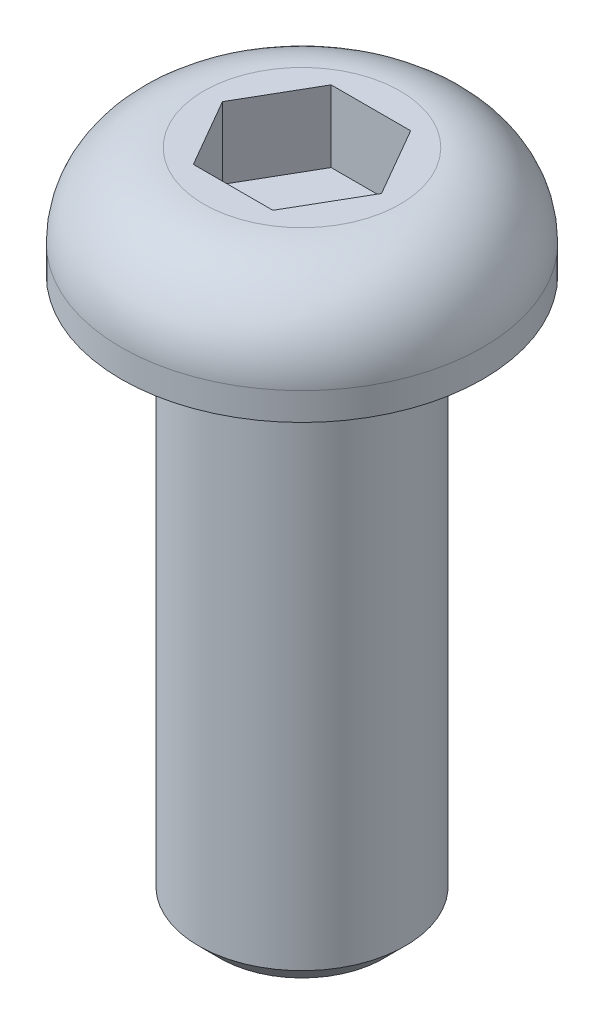
ISO-10303-21;
HEADER;
FILE_DESCRIPTION(('STEP AP214'),'2;1');
FILE_NAME('part.step','',(''),(''),'','','');
FILE_SCHEMA(('AUTOMOTIVE_DESIGN { 1 0 10303 214 1 1 1 1 }'));
ENDSEC;
DATA;
#1=APPLICATION_CONTEXT('core data for automotive mechanical design processes');
#2=APPLICATION_PROTOCOL_DEFINITION('international standard','automotive_design',2000,#1);
#3=PRODUCT_CONTEXT('',#1,'mechanical');
#4=PRODUCT('Part','Part','',(#3));
#5=PRODUCT_RELATED_PRODUCT_CATEGORY('part','',(#4));
#6=PRODUCT_DEFINITION_FORMATION('','',#4);
#7=PRODUCT_DEFINITION_CONTEXT('part definition',#1,'design');
#8=PRODUCT_DEFINITION('design','',#6,#7);
#9=PRODUCT_DEFINITION_SHAPE('','',#8);
#10=(LENGTH_UNIT() NAMED_UNIT(*) SI_UNIT(.MILLI.,.METRE.));
#11=(NAMED_UNIT(*) PLANE_ANGLE_UNIT() SI_UNIT($,.RADIAN.));
#12=(NAMED_UNIT(*) SI_UNIT($,.STERADIAN.) SOLID_ANGLE_UNIT());
#13=UNCERTAINTY_MEASURE_WITH_UNIT(LENGTH_MEASURE(1.E-05),#10,'distance_accuracy_value','');
#14=(GEOMETRIC_REPRESENTATION_CONTEXT(3) GLOBAL_UNCERTAINTY_ASSIGNED_CONTEXT((#13)) GLOBAL_UNIT_ASSIGNED_CONTEXT((#10,
#11,#12)) REPRESENTATION_CONTEXT('',''));
#15=CARTESIAN_POINT('',(0.,0.,0.));
#16=DIRECTION('',(0.,0.,1.));
#17=DIRECTION('',(1.,0.,0.));
#18=AXIS2_PLACEMENT_3D('',#15,#16,#17);
#19=CARTESIAN_POINT('',(0.,0.,0.));
#20=DIRECTION('',(0.,-1.,0.));
#21=DIRECTION('',(1.,0.,0.));
#22=AXIS2_PLACEMENT_3D('',#19,#20,#21);
#23=PLANE('',#22);
#24=DIRECTION('',(-0.5,0.,-0.866025403784438));
#25=VECTOR('',#24,1.);
#26=CARTESIAN_POINT('',(2.3094010767585,0.,0.));
#27=LINE('',#26,#25);
#28=CARTESIAN_POINT('',(2.3094010767585,0.,0.));
#29=VERTEX_POINT('',#28);
#30=CARTESIAN_POINT('',(1.15470053837925,0.,-2.));
#31=VERTEX_POINT('',#30);
#32=EDGE_CURVE('E143',#29,#31,#27,.T.);
#33=ORIENTED_EDGE('',*,*,#32,.F.);
#34=DIRECTION('',(0.5,0.,-0.866025403784439));
#35=VECTOR('',#34,1.);
#36=CARTESIAN_POINT('',(1.15470053837925,0.,2.));
#37=LINE('',#36,#35);
#38=CARTESIAN_POINT('',(1.15470053837925,0.,2.));
#39=VERTEX_POINT('',#38);
#40=EDGE_CURVE('E69',#39,#29,#37,.T.);
#41=ORIENTED_EDGE('',*,*,#40,.F.);
#42=DIRECTION('',(1.,0.,0.));
#43=VECTOR('',#42,1.);
#44=CARTESIAN_POINT('',(-1.15470053837925,0.,2.));
#45=LINE('',#44,#43);
#46=CARTESIAN_POINT('',(-1.15470053837925,0.,2.));
#47=VERTEX_POINT('',#46);
#48=EDGE_CURVE('E152',#47,#39,#45,.T.);
#49=ORIENTED_EDGE('',*,*,#48,.F.);
#50=DIRECTION('',(0.5,0.,0.866025403784439));
#51=VECTOR('',#50,1.);
#52=CARTESIAN_POINT('',(-2.3094010767585,0.,0.));
#53=LINE('',#52,#51);
#54=CARTESIAN_POINT('',(-2.3094010767585,0.,0.));
#55=VERTEX_POINT('',#54);
#56=EDGE_CURVE('E150',#55,#47,#53,.T.);
#57=ORIENTED_EDGE('',*,*,#56,.F.);
#58=DIRECTION('',(-0.5,0.,0.866025403784439));
#59=VECTOR('',#58,1.);
#60=CARTESIAN_POINT('',(-1.15470053837925,0.,-2.));
#61=LINE('',#60,#59);
#62=CARTESIAN_POINT('',(-1.15470053837925,0.,-2.));
#63=VERTEX_POINT('',#62);
#64=EDGE_CURVE('E117',#63,#55,#61,.T.);
#65=ORIENTED_EDGE('',*,*,#64,.F.);
#66=DIRECTION('',(-1.,0.,0.));
#67=VECTOR('',#66,1.);
#68=CARTESIAN_POINT('',(1.15470053837925,0.,-2.));
#69=LINE('',#68,#67);
#70=EDGE_CURVE('E146',#31,#63,#69,.T.);
#71=ORIENTED_EDGE('',*,*,#70,.F.);
#72=EDGE_LOOP('',(#33,#41,#49,#57,#65,#71));
#73=FACE_BOUND('',#72,.T.);
#74=CARTESIAN_POINT('',(0.,0.,0.));
#75=DIRECTION('',(0.,1.,0.));
#76=DIRECTION('',(-1.,0.,0.));
#77=AXIS2_PLACEMENT_3D('',#74,#75,#76);
#78=CIRCLE('',#77,2.85);
#79=CARTESIAN_POINT('',(-2.85,0.,0.));
#80=VERTEX_POINT('',#79);
#81=EDGE_CURVE('E167',#80,#80,#78,.T.);
#82=ORIENTED_EDGE('',*,*,#81,.T.);
#83=EDGE_LOOP('',(#82));
#84=FACE_BOUND('',#83,.T.);
#85=ADVANCED_FACE('F53',(#73,#84),#23,.F.);
#86=CARTESIAN_POINT('',(0.,-2.4,0.));
#87=DIRECTION('',(0.,1.,0.));
#88=DIRECTION('',(-1.,0.,0.));
#89=AXIS2_PLACEMENT_3D('',#86,#87,#88);
#90=TOROIDAL_SURFACE('',#89,2.85,2.4);
#91=ORIENTED_EDGE('',*,*,#81,.F.);
#92=EDGE_LOOP('',(#91));
#93=FACE_BOUND('',#92,.T.);
#94=CARTESIAN_POINT('',(0.,-2.4,0.));
#95=DIRECTION('',(0.,1.,0.));
#96=DIRECTION('',(-1.,0.,0.));
#97=AXIS2_PLACEMENT_3D('',#94,#95,#96);
#98=CIRCLE('',#97,5.25);
#99=CARTESIAN_POINT('',(-5.25,-2.4,0.));
#100=VERTEX_POINT('',#99);
#101=EDGE_CURVE('E164',#100,#100,#98,.T.);
#102=ORIENTED_EDGE('',*,*,#101,.T.);
#103=EDGE_LOOP('',(#102));
#104=FACE_BOUND('',#103,.T.);
#105=ADVANCED_FACE('F192',(#93,#104),#90,.T.);
#106=CARTESIAN_POINT('',(0.,5.,0.));
#107=DIRECTION('',(0.,1.,0.));
#108=DIRECTION('',(-1.,0.,0.));
#109=AXIS2_PLACEMENT_3D('',#106,#107,#108);
#110=CYLINDRICAL_SURFACE('',#109,5.25);
#111=ORIENTED_EDGE('',*,*,#101,.F.);
#112=EDGE_LOOP('',(#111));
#113=FACE_BOUND('',#112,.T.);
#114=CARTESIAN_POINT('',(0.,-3.2,0.));
#115=DIRECTION('',(0.,1.,0.));
#116=DIRECTION('',(-1.,0.,0.));
#117=AXIS2_PLACEMENT_3D('',#114,#115,#116);
#118=CIRCLE('',#117,5.25);
#119=CARTESIAN_POINT('',(-5.25,-3.2,0.));
#120=VERTEX_POINT('',#119);
#121=EDGE_CURVE('E156',#120,#120,#118,.T.);
#122=ORIENTED_EDGE('',*,*,#121,.T.);
#123=EDGE_LOOP('',(#122));
#124=FACE_BOUND('',#123,.T.);
#125=ADVANCED_FACE('F200',(#113,#124),#110,.T.);
#126=CARTESIAN_POINT('',(5.25,-3.2,0.));
#127=DIRECTION('',(0.,1.,0.));
#128=DIRECTION('',(-1.,0.,0.));
#129=AXIS2_PLACEMENT_3D('',#126,#127,#128);
#130=PLANE('',#129);
#131=CARTESIAN_POINT('',(0.,-3.2,0.));
#132=DIRECTION('',(0.,1.,0.));
#133=DIRECTION('',(-1.,0.,0.));
#134=AXIS2_PLACEMENT_3D('',#131,#132,#133);
#135=CIRCLE('',#134,3.25);
#136=CARTESIAN_POINT('',(-3.25,-3.2,0.));
#137=VERTEX_POINT('',#136);
#138=EDGE_CURVE('E170',#137,#137,#135,.T.);
#139=ORIENTED_EDGE('',*,*,#138,.T.);
#140=EDGE_LOOP('',(#139));
#141=FACE_BOUND('',#140,.T.);
#142=ORIENTED_EDGE('',*,*,#121,.F.);
#143=EDGE_LOOP('',(#142));
#144=FACE_BOUND('',#143,.T.);
#145=ADVANCED_FACE('F207',(#141,#144),#130,.F.);
#146=CARTESIAN_POINT('',(0.,5.,0.));
#147=DIRECTION('',(0.,1.,0.));
#148=DIRECTION('',(-1.,0.,0.));
#149=AXIS2_PLACEMENT_3D('',#146,#147,#148);
#150=CYLINDRICAL_SURFACE('',#149,3.);
#151=CARTESIAN_POINT('',(0.,-18.575,0.));
#152=DIRECTION('',(0.,1.,0.));
#153=DIRECTION('',(-1.,0.,0.));
#154=AXIS2_PLACEMENT_3D('',#151,#152,#153);
#155=CIRCLE('',#154,3.);
#156=CARTESIAN_POINT('',(-3.,-18.575,0.));
#157=VERTEX_POINT('',#156);
#158=EDGE_CURVE('E62',#157,#157,#155,.T.);
#159=ORIENTED_EDGE('',*,*,#158,.T.);
#160=EDGE_LOOP('',(#159));
#161=FACE_BOUND('',#160,.T.);
#162=CARTESIAN_POINT('',(0.,-3.45,0.));
#163=DIRECTION('',(0.,1.,0.));
#164=DIRECTION('',(-1.,0.,0.));
#165=AXIS2_PLACEMENT_3D('',#162,#163,#164);
#166=CIRCLE('',#165,3.);
#167=CARTESIAN_POINT('',(-3.,-3.45,0.));
#168=VERTEX_POINT('',#167);
#169=EDGE_CURVE('E173',#168,#168,#166,.F.);
#170=ORIENTED_EDGE('',*,*,#169,.T.);
#171=EDGE_LOOP('',(#170));
#172=FACE_BOUND('',#171,.T.);
#173=ADVANCED_FACE('F178',(#161,#172),#150,.T.);
#174=CARTESIAN_POINT('',(3.,-19.2,0.));
#175=DIRECTION('',(0.,1.,0.));
#176=DIRECTION('',(-1.,0.,0.));
#177=AXIS2_PLACEMENT_3D('',#174,#175,#176);
#178=PLANE('',#177);
#179=CARTESIAN_POINT('',(0.,-19.2,0.));
#180=DIRECTION('',(0.,1.,0.));
#181=DIRECTION('',(-1.,0.,0.));
#182=AXIS2_PLACEMENT_3D('',#179,#180,#181);
#183=CIRCLE('',#182,2.375);
#184=CARTESIAN_POINT('',(-2.37499999999999,-19.2,0.));
#185=VERTEX_POINT('',#184);
#186=EDGE_CURVE('E11',#185,#185,#183,.F.);
#187=ORIENTED_EDGE('',*,*,#186,.T.);
#188=EDGE_LOOP('',(#187));
#189=FACE_BOUND('',#188,.T.);
#190=ADVANCED_FACE('F214',(#189),#178,.F.);
#191=CARTESIAN_POINT('',(1.15470053837925,-2.08,2.));
#192=DIRECTION('',(0.866025403784439,0.,0.5));
#193=DIRECTION('',(0.5,0.,-0.866025403784439));
#194=AXIS2_PLACEMENT_3D('',#191,#192,#193);
#195=PLANE('',#194);
#196=ORIENTED_EDGE('',*,*,#40,.T.);
#197=DIRECTION('',(0.,1.,0.));
#198=VECTOR('',#197,1.);
#199=CARTESIAN_POINT('',(2.3094010767585,-2.08,0.));
#200=LINE('',#199,#198);
#201=CARTESIAN_POINT('',(2.3094010767585,-2.08,0.));
#202=VERTEX_POINT('',#201);
#203=EDGE_CURVE('E99',#202,#29,#200,.T.);
#204=ORIENTED_EDGE('',*,*,#203,.F.);
#205=DIRECTION('',(0.5,0.,-0.866025403784439));
#206=VECTOR('',#205,1.);
#207=CARTESIAN_POINT('',(1.15470053837925,-2.08,2.));
#208=LINE('',#207,#206);
#209=CARTESIAN_POINT('',(1.15470053837925,-2.08,2.));
#210=VERTEX_POINT('',#209);
#211=EDGE_CURVE('E154',#210,#202,#208,.T.);
#212=ORIENTED_EDGE('',*,*,#211,.F.);
#213=DIRECTION('',(0.,1.,0.));
#214=VECTOR('',#213,1.);
#215=CARTESIAN_POINT('',(1.15470053837925,-2.08,2.));
#216=LINE('',#215,#214);
#217=EDGE_CURVE('E77',#210,#39,#216,.T.);
#218=ORIENTED_EDGE('',*,*,#217,.T.);
#219=EDGE_LOOP('',(#196,#204,#212,#218));
#220=FACE_BOUND('',#219,.T.);
#221=ADVANCED_FACE('F217',(#220),#195,.F.);
#222=CARTESIAN_POINT('',(-1.15470053837925,-2.08,2.));
#223=DIRECTION('',(0.,0.,1.));
#224=DIRECTION('',(1.,0.,0.));
#225=AXIS2_PLACEMENT_3D('',#222,#223,#224);
#226=PLANE('',#225);
#227=ORIENTED_EDGE('',*,*,#48,.T.);
#228=ORIENTED_EDGE('',*,*,#217,.F.);
#229=DIRECTION('',(1.,0.,0.));
#230=VECTOR('',#229,1.);
#231=CARTESIAN_POINT('',(-1.15470053837925,-2.08,2.));
#232=LINE('',#231,#230);
#233=CARTESIAN_POINT('',(-1.15470053837925,-2.08,2.));
#234=VERTEX_POINT('',#233);
#235=EDGE_CURVE('E129',#234,#210,#232,.T.);
#236=ORIENTED_EDGE('',*,*,#235,.F.);
#237=DIRECTION('',(0.,1.,0.));
#238=VECTOR('',#237,1.);
#239=CARTESIAN_POINT('',(-1.15470053837925,-2.08,2.));
#240=LINE('',#239,#238);
#241=EDGE_CURVE('E121',#234,#47,#240,.T.);
#242=ORIENTED_EDGE('',*,*,#241,.T.);
#243=EDGE_LOOP('',(#227,#228,#236,#242));
#244=FACE_BOUND('',#243,.T.);
#245=ADVANCED_FACE('F220',(#244),#226,.F.);
#246=CARTESIAN_POINT('',(-2.3094010767585,-2.08,0.));
#247=DIRECTION('',(-0.866025403784439,0.,0.5));
#248=DIRECTION('',(0.5,0.,0.866025403784439));
#249=AXIS2_PLACEMENT_3D('',#246,#247,#248);
#250=PLANE('',#249);
#251=ORIENTED_EDGE('',*,*,#56,.T.);
#252=ORIENTED_EDGE('',*,*,#241,.F.);
#253=DIRECTION('',(0.5,0.,0.866025403784439));
#254=VECTOR('',#253,1.);
#255=CARTESIAN_POINT('',(-2.3094010767585,-2.08,0.));
#256=LINE('',#255,#254);
#257=CARTESIAN_POINT('',(-2.3094010767585,-2.08,0.));
#258=VERTEX_POINT('',#257);
#259=EDGE_CURVE('E125',#258,#234,#256,.T.);
#260=ORIENTED_EDGE('',*,*,#259,.F.);
#261=DIRECTION('',(0.,1.,0.));
#262=VECTOR('',#261,1.);
#263=CARTESIAN_POINT('',(-2.3094010767585,-2.08,0.));
#264=LINE('',#263,#262);
#265=EDGE_CURVE('E110',#258,#55,#264,.T.);
#266=ORIENTED_EDGE('',*,*,#265,.T.);
#267=EDGE_LOOP('',(#251,#252,#260,#266));
#268=FACE_BOUND('',#267,.T.);
#269=ADVANCED_FACE('F126',(#268),#250,.F.);
#270=CARTESIAN_POINT('',(-1.15470053837925,-2.08,-2.));
#271=DIRECTION('',(-0.866025403784439,0.,-0.5));
#272=DIRECTION('',(-0.5,0.,0.866025403784439));
#273=AXIS2_PLACEMENT_3D('',#270,#271,#272);
#274=PLANE('',#273);
#275=ORIENTED_EDGE('',*,*,#64,.T.);
#276=ORIENTED_EDGE('',*,*,#265,.F.);
#277=DIRECTION('',(-0.5,0.,0.866025403784439));
#278=VECTOR('',#277,1.);
#279=CARTESIAN_POINT('',(-1.15470053837925,-2.08,-2.));
#280=LINE('',#279,#278);
#281=CARTESIAN_POINT('',(-1.15470053837925,-2.08,-2.));
#282=VERTEX_POINT('',#281);
#283=EDGE_CURVE('E114',#282,#258,#280,.T.);
#284=ORIENTED_EDGE('',*,*,#283,.F.);
#285=DIRECTION('',(0.,1.,0.));
#286=VECTOR('',#285,1.);
#287=CARTESIAN_POINT('',(-1.15470053837925,-2.08,-2.));
#288=LINE('',#287,#286);
#289=EDGE_CURVE('E122',#282,#63,#288,.T.);
#290=ORIENTED_EDGE('',*,*,#289,.T.);
#291=EDGE_LOOP('',(#275,#276,#284,#290));
#292=FACE_BOUND('',#291,.T.);
#293=ADVANCED_FACE('F112',(#292),#274,.F.);
#294=CARTESIAN_POINT('',(1.15470053837925,-2.08,-2.));
#295=DIRECTION('',(0.,0.,-1.));
#296=DIRECTION('',(-1.,0.,0.));
#297=AXIS2_PLACEMENT_3D('',#294,#295,#296);
#298=PLANE('',#297);
#299=ORIENTED_EDGE('',*,*,#70,.T.);
#300=ORIENTED_EDGE('',*,*,#289,.F.);
#301=DIRECTION('',(-1.,0.,0.));
#302=VECTOR('',#301,1.);
#303=CARTESIAN_POINT('',(1.15470053837925,-2.08,-2.));
#304=LINE('',#303,#302);
#305=CARTESIAN_POINT('',(1.15470053837925,-2.08,-2.));
#306=VERTEX_POINT('',#305);
#307=EDGE_CURVE('E135',#306,#282,#304,.T.);
#308=ORIENTED_EDGE('',*,*,#307,.F.);
#309=DIRECTION('',(0.,1.,0.));
#310=VECTOR('',#309,1.);
#311=CARTESIAN_POINT('',(1.15470053837925,-2.08,-2.));
#312=LINE('',#311,#310);
#313=EDGE_CURVE('E159',#306,#31,#312,.T.);
#314=ORIENTED_EDGE('',*,*,#313,.T.);
#315=EDGE_LOOP('',(#299,#300,#308,#314));
#316=FACE_BOUND('',#315,.T.);
#317=ADVANCED_FACE('F224',(#316),#298,.F.);
#318=CARTESIAN_POINT('',(2.3094010767585,-2.08,0.));
#319=DIRECTION('',(0.866025403784438,0.,-0.5));
#320=DIRECTION('',(-0.5,0.,-0.866025403784439));
#321=AXIS2_PLACEMENT_3D('',#318,#319,#320);
#322=PLANE('',#321);
#323=ORIENTED_EDGE('',*,*,#32,.T.);
#324=ORIENTED_EDGE('',*,*,#313,.F.);
#325=DIRECTION('',(-0.5,0.,-0.866025403784438));
#326=VECTOR('',#325,1.);
#327=CARTESIAN_POINT('',(2.3094010767585,-2.08,0.));
#328=LINE('',#327,#326);
#329=EDGE_CURVE('E137',#202,#306,#328,.T.);
#330=ORIENTED_EDGE('',*,*,#329,.F.);
#331=ORIENTED_EDGE('',*,*,#203,.T.);
#332=EDGE_LOOP('',(#323,#324,#330,#331));
#333=FACE_BOUND('',#332,.T.);
#334=ADVANCED_FACE('F221',(#333),#322,.F.);
#335=CARTESIAN_POINT('',(0.,-2.08,0.));
#336=DIRECTION('',(0.,1.,0.));
#337=DIRECTION('',(-1.,0.,0.));
#338=AXIS2_PLACEMENT_3D('',#335,#336,#337);
#339=PLANE('',#338);
#340=ORIENTED_EDGE('',*,*,#211,.T.);
#341=ORIENTED_EDGE('',*,*,#329,.T.);
#342=ORIENTED_EDGE('',*,*,#307,.T.);
#343=ORIENTED_EDGE('',*,*,#283,.T.);
#344=ORIENTED_EDGE('',*,*,#259,.T.);
#345=ORIENTED_EDGE('',*,*,#235,.T.);
#346=EDGE_LOOP('',(#340,#341,#342,#343,#344,#345));
#347=FACE_BOUND('',#346,.T.);
#348=ADVANCED_FACE('F132',(#347),#339,.T.);
#349=CARTESIAN_POINT('',(0.,-3.45,0.));
#350=DIRECTION('',(0.,1.,0.));
#351=DIRECTION('',(-1.,0.,0.));
#352=AXIS2_PLACEMENT_3D('',#349,#350,#351);
#353=TOROIDAL_SURFACE('',#352,3.25,0.25);
#354=ORIENTED_EDGE('',*,*,#169,.F.);
#355=EDGE_LOOP('',(#354));
#356=FACE_BOUND('',#355,.T.);
#357=ORIENTED_EDGE('',*,*,#138,.F.);
#358=EDGE_LOOP('',(#357));
#359=FACE_BOUND('',#358,.T.);
#360=ADVANCED_FACE('F182',(#356,#359),#353,.F.);
#361=CARTESIAN_POINT('',(0.,-18.575,0.));
#362=DIRECTION('',(0.,1.,0.));
#363=DIRECTION('',(-1.,0.,0.));
#364=AXIS2_PLACEMENT_3D('',#361,#362,#363);
#365=CONICAL_SURFACE('',#364,3.,0.785398163397451);
#366=ORIENTED_EDGE('',*,*,#186,.F.);
#367=EDGE_LOOP('',(#366));
#368=FACE_BOUND('',#367,.T.);
#369=ORIENTED_EDGE('',*,*,#158,.F.);
#370=EDGE_LOOP('',(#369));
#371=FACE_BOUND('',#370,.T.);
#372=ADVANCED_FACE('F56',(#368,#371),#365,.T.);
#373=CLOSED_SHELL('',(#85,#105,#125,#145,#173,#190,#221,#245,#269,#293,#317,#334,#348,#360,#372));
#374=MANIFOLD_SOLID_BREP('B2',#373);
#375=ADVANCED_BREP_SHAPE_REPRESENTATION('',(#18,#374),#14);
#376=SHAPE_DEFINITION_REPRESENTATION(#9,#375);
ENDSEC;
END-ISO-10303-21;
